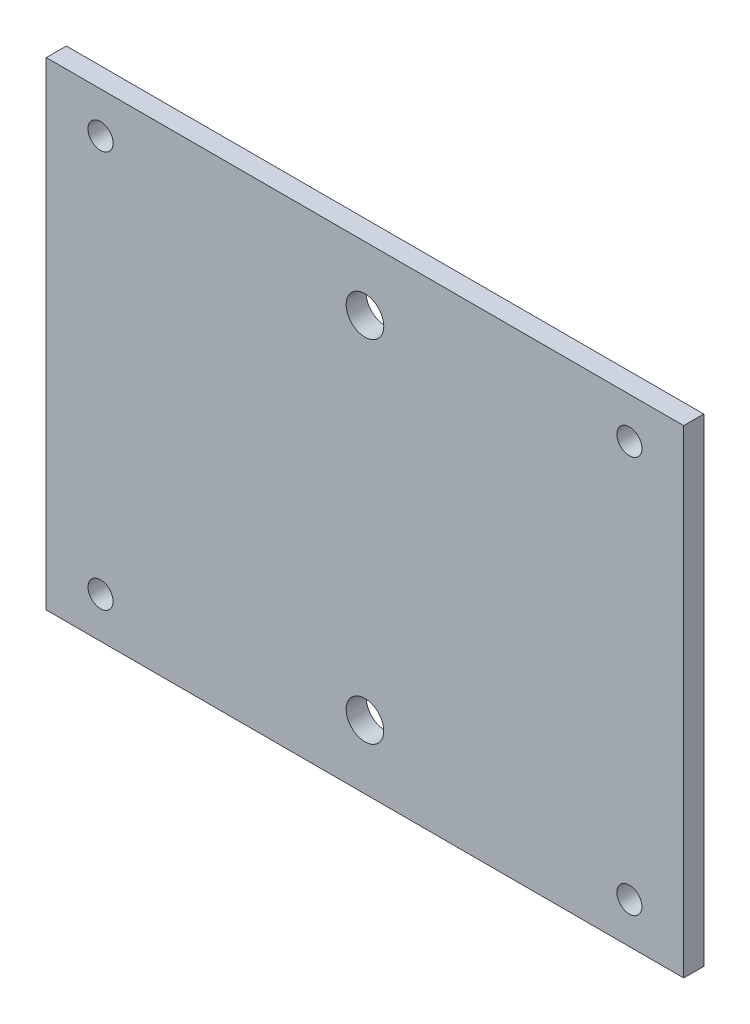
ISO-10303-21;
HEADER;
FILE_DESCRIPTION(('STEP AP214'),'2;1');
FILE_NAME('part.step','',(''),(''),'','','');
FILE_SCHEMA(('AUTOMOTIVE_DESIGN { 1 0 10303 214 1 1 1 1 }'));
ENDSEC;
DATA;
#1=APPLICATION_CONTEXT('core data for automotive mechanical design processes');
#2=APPLICATION_PROTOCOL_DEFINITION('international standard','automotive_design',2000,#1);
#3=PRODUCT_CONTEXT('',#1,'mechanical');
#4=PRODUCT('Part','Part','',(#3));
#5=PRODUCT_RELATED_PRODUCT_CATEGORY('part','',(#4));
#6=PRODUCT_DEFINITION_FORMATION('','',#4);
#7=PRODUCT_DEFINITION_CONTEXT('part definition',#1,'design');
#8=PRODUCT_DEFINITION('design','',#6,#7);
#9=PRODUCT_DEFINITION_SHAPE('','',#8);
#10=(LENGTH_UNIT() NAMED_UNIT(*) SI_UNIT(.MILLI.,.METRE.));
#11=(NAMED_UNIT(*) PLANE_ANGLE_UNIT() SI_UNIT($,.RADIAN.));
#12=(NAMED_UNIT(*) SI_UNIT($,.STERADIAN.) SOLID_ANGLE_UNIT());
#13=UNCERTAINTY_MEASURE_WITH_UNIT(LENGTH_MEASURE(1.E-05),#10,'distance_accuracy_value','');
#14=(GEOMETRIC_REPRESENTATION_CONTEXT(3) GLOBAL_UNCERTAINTY_ASSIGNED_CONTEXT((#13)) GLOBAL_UNIT_ASSIGNED_CONTEXT((#10,
#11,#12)) REPRESENTATION_CONTEXT('',''));
#15=CARTESIAN_POINT('',(0.,0.,0.));
#16=DIRECTION('',(0.,0.,1.));
#17=DIRECTION('',(1.,0.,0.));
#18=AXIS2_PLACEMENT_3D('',#15,#16,#17);
#19=CARTESIAN_POINT('',(0.,0.,1.6));
#20=DIRECTION('',(0.,0.,-1.));
#21=DIRECTION('',(-1.,0.,0.));
#22=AXIS2_PLACEMENT_3D('',#19,#20,#21);
#23=PLANE('',#22);
#24=DIRECTION('',(0.,1.,0.));
#25=VECTOR('',#24,1.);
#26=CARTESIAN_POINT('',(25.42,-19.075,1.6));
#27=LINE('',#26,#25);
#28=CARTESIAN_POINT('',(25.42,-19.075,1.6));
#29=VERTEX_POINT('',#28);
#30=CARTESIAN_POINT('',(25.42,19.075,1.6));
#31=VERTEX_POINT('',#30);
#32=EDGE_CURVE('E100',#29,#31,#27,.T.);
#33=ORIENTED_EDGE('',*,*,#32,.T.);
#34=DIRECTION('',(-1.,0.,0.));
#35=VECTOR('',#34,1.);
#36=CARTESIAN_POINT('',(-25.42,19.075,1.6));
#37=LINE('',#36,#35);
#38=CARTESIAN_POINT('',(-25.42,19.075,1.6));
#39=VERTEX_POINT('',#38);
#40=EDGE_CURVE('E95',#31,#39,#37,.T.);
#41=ORIENTED_EDGE('',*,*,#40,.T.);
#42=DIRECTION('',(0.,-1.,0.));
#43=VECTOR('',#42,1.);
#44=CARTESIAN_POINT('',(-25.42,-19.075,1.6));
#45=LINE('',#44,#43);
#46=CARTESIAN_POINT('',(-25.42,-19.075,1.6));
#47=VERTEX_POINT('',#46);
#48=EDGE_CURVE('E98',#39,#47,#45,.T.);
#49=ORIENTED_EDGE('',*,*,#48,.T.);
#50=DIRECTION('',(1.,0.,0.));
#51=VECTOR('',#50,1.);
#52=CARTESIAN_POINT('',(-25.42,-19.075,1.6));
#53=LINE('',#52,#51);
#54=EDGE_CURVE('E65',#47,#29,#53,.T.);
#55=ORIENTED_EDGE('',*,*,#54,.T.);
#56=EDGE_LOOP('',(#33,#41,#49,#55));
#57=FACE_BOUND('',#56,.T.);
#58=CARTESIAN_POINT('',(0.,13.975,1.6));
#59=DIRECTION('',(0.,0.,1.));
#60=DIRECTION('',(1.,0.,0.));
#61=AXIS2_PLACEMENT_3D('',#58,#59,#60);
#62=CIRCLE('',#61,1.5);
#63=CARTESIAN_POINT('',(1.5,13.975,1.6));
#64=VERTEX_POINT('',#63);
#65=EDGE_CURVE('E120',#64,#64,#62,.T.);
#66=ORIENTED_EDGE('',*,*,#65,.F.);
#67=EDGE_LOOP('',(#66));
#68=FACE_BOUND('',#67,.T.);
#69=CARTESIAN_POINT('',(0.,-13.975,1.6));
#70=DIRECTION('',(0.,0.,1.));
#71=DIRECTION('',(-1.,0.,0.));
#72=AXIS2_PLACEMENT_3D('',#69,#70,#71);
#73=CIRCLE('',#72,1.5);
#74=CARTESIAN_POINT('',(-1.5,-13.975,1.6));
#75=VERTEX_POINT('',#74);
#76=EDGE_CURVE('E142',#75,#75,#73,.T.);
#77=ORIENTED_EDGE('',*,*,#76,.F.);
#78=EDGE_LOOP('',(#77));
#79=FACE_BOUND('',#78,.T.);
#80=CARTESIAN_POINT('',(-21.0889384010485,15.825,1.6));
#81=DIRECTION('',(0.,0.,1.));
#82=DIRECTION('',(1.,0.,0.));
#83=AXIS2_PLACEMENT_3D('',#80,#81,#82);
#84=CIRCLE('',#83,1.);
#85=CARTESIAN_POINT('',(-20.0889384010485,15.825,1.6));
#86=VERTEX_POINT('',#85);
#87=EDGE_CURVE('E150',#86,#86,#84,.T.);
#88=ORIENTED_EDGE('',*,*,#87,.F.);
#89=EDGE_LOOP('',(#88));
#90=FACE_BOUND('',#89,.T.);
#91=CARTESIAN_POINT('',(21.0889384010485,15.825,1.6));
#92=DIRECTION('',(0.,0.,1.));
#93=DIRECTION('',(-1.,0.,0.));
#94=AXIS2_PLACEMENT_3D('',#91,#92,#93);
#95=CIRCLE('',#94,1.);
#96=CARTESIAN_POINT('',(20.0889384010485,15.825,1.6));
#97=VERTEX_POINT('',#96);
#98=EDGE_CURVE('E158',#97,#97,#95,.T.);
#99=ORIENTED_EDGE('',*,*,#98,.F.);
#100=EDGE_LOOP('',(#99));
#101=FACE_BOUND('',#100,.T.);
#102=CARTESIAN_POINT('',(21.0889384010485,-15.825,1.6));
#103=DIRECTION('',(0.,0.,1.));
#104=DIRECTION('',(1.,0.,0.));
#105=AXIS2_PLACEMENT_3D('',#102,#103,#104);
#106=CIRCLE('',#105,1.);
#107=CARTESIAN_POINT('',(22.0889384010485,-15.825,1.6));
#108=VERTEX_POINT('',#107);
#109=EDGE_CURVE('E166',#108,#108,#106,.T.);
#110=ORIENTED_EDGE('',*,*,#109,.F.);
#111=EDGE_LOOP('',(#110));
#112=FACE_BOUND('',#111,.T.);
#113=CARTESIAN_POINT('',(-21.0889384010485,-15.825,1.6));
#114=DIRECTION('',(0.,0.,1.));
#115=DIRECTION('',(-1.,0.,0.));
#116=AXIS2_PLACEMENT_3D('',#113,#114,#115);
#117=CIRCLE('',#116,1.);
#118=CARTESIAN_POINT('',(-22.0889384010485,-15.825,1.6));
#119=VERTEX_POINT('',#118);
#120=EDGE_CURVE('E174',#119,#119,#117,.T.);
#121=ORIENTED_EDGE('',*,*,#120,.F.);
#122=EDGE_LOOP('',(#121));
#123=FACE_BOUND('',#122,.T.);
#124=ADVANCED_FACE('F47',(#57,#68,#79,#90,#101,#112,#123),#23,.F.);
#125=CARTESIAN_POINT('',(0.,0.,0.));
#126=DIRECTION('',(0.,0.,-1.));
#127=DIRECTION('',(-1.,0.,0.));
#128=AXIS2_PLACEMENT_3D('',#125,#126,#127);
#129=PLANE('',#128);
#130=CARTESIAN_POINT('',(21.0889384010485,-15.825,0.));
#131=DIRECTION('',(0.,0.,1.));
#132=DIRECTION('',(1.,0.,0.));
#133=AXIS2_PLACEMENT_3D('',#130,#131,#132);
#134=CIRCLE('',#133,1.);
#135=CARTESIAN_POINT('',(22.0889384010485,-15.825,0.));
#136=VERTEX_POINT('',#135);
#137=EDGE_CURVE('E170',#136,#136,#134,.T.);
#138=ORIENTED_EDGE('',*,*,#137,.T.);
#139=EDGE_LOOP('',(#138));
#140=FACE_BOUND('',#139,.T.);
#141=CARTESIAN_POINT('',(-21.0889384010485,15.825,0.));
#142=DIRECTION('',(0.,0.,1.));
#143=DIRECTION('',(1.,0.,0.));
#144=AXIS2_PLACEMENT_3D('',#141,#142,#143);
#145=CIRCLE('',#144,1.);
#146=CARTESIAN_POINT('',(-20.0889384010485,15.825,0.));
#147=VERTEX_POINT('',#146);
#148=EDGE_CURVE('E154',#147,#147,#145,.T.);
#149=ORIENTED_EDGE('',*,*,#148,.T.);
#150=EDGE_LOOP('',(#149));
#151=FACE_BOUND('',#150,.T.);
#152=CARTESIAN_POINT('',(0.,13.975,0.));
#153=DIRECTION('',(0.,0.,1.));
#154=DIRECTION('',(1.,0.,0.));
#155=AXIS2_PLACEMENT_3D('',#152,#153,#154);
#156=CIRCLE('',#155,1.5);
#157=CARTESIAN_POINT('',(1.5,13.975,0.));
#158=VERTEX_POINT('',#157);
#159=EDGE_CURVE('E138',#158,#158,#156,.T.);
#160=ORIENTED_EDGE('',*,*,#159,.T.);
#161=EDGE_LOOP('',(#160));
#162=FACE_BOUND('',#161,.T.);
#163=DIRECTION('',(0.,1.,0.));
#164=VECTOR('',#163,1.);
#165=CARTESIAN_POINT('',(25.42,-19.075,0.));
#166=LINE('',#165,#164);
#167=CARTESIAN_POINT('',(25.42,-19.075,0.));
#168=VERTEX_POINT('',#167);
#169=CARTESIAN_POINT('',(25.42,19.075,0.));
#170=VERTEX_POINT('',#169);
#171=EDGE_CURVE('E116',#168,#170,#166,.T.);
#172=ORIENTED_EDGE('',*,*,#171,.F.);
#173=DIRECTION('',(1.,0.,0.));
#174=VECTOR('',#173,1.);
#175=CARTESIAN_POINT('',(-25.42,-19.075,0.));
#176=LINE('',#175,#174);
#177=CARTESIAN_POINT('',(-25.42,-19.075,0.));
#178=VERTEX_POINT('',#177);
#179=EDGE_CURVE('E88',#178,#168,#176,.T.);
#180=ORIENTED_EDGE('',*,*,#179,.F.);
#181=DIRECTION('',(0.,-1.,0.));
#182=VECTOR('',#181,1.);
#183=CARTESIAN_POINT('',(-25.42,-19.075,0.));
#184=LINE('',#183,#182);
#185=CARTESIAN_POINT('',(-25.42,19.075,0.));
#186=VERTEX_POINT('',#185);
#187=EDGE_CURVE('E82',#186,#178,#184,.T.);
#188=ORIENTED_EDGE('',*,*,#187,.F.);
#189=DIRECTION('',(-1.,0.,0.));
#190=VECTOR('',#189,1.);
#191=CARTESIAN_POINT('',(-25.42,19.075,0.));
#192=LINE('',#191,#190);
#193=EDGE_CURVE('E105',#170,#186,#192,.T.);
#194=ORIENTED_EDGE('',*,*,#193,.F.);
#195=EDGE_LOOP('',(#172,#180,#188,#194));
#196=FACE_BOUND('',#195,.T.);
#197=CARTESIAN_POINT('',(0.,-13.975,0.));
#198=DIRECTION('',(0.,0.,1.));
#199=DIRECTION('',(-1.,0.,0.));
#200=AXIS2_PLACEMENT_3D('',#197,#198,#199);
#201=CIRCLE('',#200,1.5);
#202=CARTESIAN_POINT('',(-1.5,-13.975,0.));
#203=VERTEX_POINT('',#202);
#204=EDGE_CURVE('E146',#203,#203,#201,.T.);
#205=ORIENTED_EDGE('',*,*,#204,.T.);
#206=EDGE_LOOP('',(#205));
#207=FACE_BOUND('',#206,.T.);
#208=CARTESIAN_POINT('',(21.0889384010485,15.825,0.));
#209=DIRECTION('',(0.,0.,1.));
#210=DIRECTION('',(-1.,0.,0.));
#211=AXIS2_PLACEMENT_3D('',#208,#209,#210);
#212=CIRCLE('',#211,1.);
#213=CARTESIAN_POINT('',(20.0889384010485,15.825,0.));
#214=VERTEX_POINT('',#213);
#215=EDGE_CURVE('E162',#214,#214,#212,.T.);
#216=ORIENTED_EDGE('',*,*,#215,.T.);
#217=EDGE_LOOP('',(#216));
#218=FACE_BOUND('',#217,.T.);
#219=CARTESIAN_POINT('',(-21.0889384010485,-15.825,0.));
#220=DIRECTION('',(0.,0.,1.));
#221=DIRECTION('',(-1.,0.,0.));
#222=AXIS2_PLACEMENT_3D('',#219,#220,#221);
#223=CIRCLE('',#222,1.);
#224=CARTESIAN_POINT('',(-22.0889384010485,-15.825,0.));
#225=VERTEX_POINT('',#224);
#226=EDGE_CURVE('E178',#225,#225,#223,.T.);
#227=ORIENTED_EDGE('',*,*,#226,.T.);
#228=EDGE_LOOP('',(#227));
#229=FACE_BOUND('',#228,.T.);
#230=ADVANCED_FACE('F133',(#140,#151,#162,#196,#207,#218,#229),#129,.T.);
#231=CARTESIAN_POINT('',(25.42,-19.075,1.6));
#232=DIRECTION('',(-1.,0.,0.));
#233=DIRECTION('',(0.,0.,1.));
#234=AXIS2_PLACEMENT_3D('',#231,#232,#233);
#235=PLANE('',#234);
#236=ORIENTED_EDGE('',*,*,#171,.T.);
#237=DIRECTION('',(0.,0.,-1.));
#238=VECTOR('',#237,1.);
#239=CARTESIAN_POINT('',(25.42,19.075,1.6));
#240=LINE('',#239,#238);
#241=EDGE_CURVE('E11',#31,#170,#240,.T.);
#242=ORIENTED_EDGE('',*,*,#241,.F.);
#243=ORIENTED_EDGE('',*,*,#32,.F.);
#244=DIRECTION('',(0.,0.,-1.));
#245=VECTOR('',#244,1.);
#246=CARTESIAN_POINT('',(25.42,-19.075,1.6));
#247=LINE('',#246,#245);
#248=EDGE_CURVE('E112',#29,#168,#247,.T.);
#249=ORIENTED_EDGE('',*,*,#248,.T.);
#250=EDGE_LOOP('',(#236,#242,#243,#249));
#251=FACE_BOUND('',#250,.T.);
#252=ADVANCED_FACE('F49',(#251),#235,.F.);
#253=CARTESIAN_POINT('',(-25.42,19.075,1.6));
#254=DIRECTION('',(0.,-1.,0.));
#255=DIRECTION('',(0.,0.,-1.));
#256=AXIS2_PLACEMENT_3D('',#253,#254,#255);
#257=PLANE('',#256);
#258=ORIENTED_EDGE('',*,*,#193,.T.);
#259=DIRECTION('',(0.,0.,-1.));
#260=VECTOR('',#259,1.);
#261=CARTESIAN_POINT('',(-25.42,19.075,1.6));
#262=LINE('',#261,#260);
#263=EDGE_CURVE('E57',#39,#186,#262,.T.);
#264=ORIENTED_EDGE('',*,*,#263,.F.);
#265=ORIENTED_EDGE('',*,*,#40,.F.);
#266=ORIENTED_EDGE('',*,*,#241,.T.);
#267=EDGE_LOOP('',(#258,#264,#265,#266));
#268=FACE_BOUND('',#267,.T.);
#269=ADVANCED_FACE('F104',(#268),#257,.F.);
#270=CARTESIAN_POINT('',(-25.42,-19.075,1.6));
#271=DIRECTION('',(1.,0.,0.));
#272=DIRECTION('',(0.,0.,-1.));
#273=AXIS2_PLACEMENT_3D('',#270,#271,#272);
#274=PLANE('',#273);
#275=ORIENTED_EDGE('',*,*,#187,.T.);
#276=DIRECTION('',(0.,0.,-1.));
#277=VECTOR('',#276,1.);
#278=CARTESIAN_POINT('',(-25.42,-19.075,1.6));
#279=LINE('',#278,#277);
#280=EDGE_CURVE('E107',#47,#178,#279,.T.);
#281=ORIENTED_EDGE('',*,*,#280,.F.);
#282=ORIENTED_EDGE('',*,*,#48,.F.);
#283=ORIENTED_EDGE('',*,*,#263,.T.);
#284=EDGE_LOOP('',(#275,#281,#282,#283));
#285=FACE_BOUND('',#284,.T.);
#286=ADVANCED_FACE('F108',(#285),#274,.F.);
#287=CARTESIAN_POINT('',(-25.42,-19.075,1.6));
#288=DIRECTION('',(0.,1.,0.));
#289=DIRECTION('',(0.,0.,1.));
#290=AXIS2_PLACEMENT_3D('',#287,#288,#289);
#291=PLANE('',#290);
#292=ORIENTED_EDGE('',*,*,#179,.T.);
#293=ORIENTED_EDGE('',*,*,#248,.F.);
#294=ORIENTED_EDGE('',*,*,#54,.F.);
#295=ORIENTED_EDGE('',*,*,#280,.T.);
#296=EDGE_LOOP('',(#292,#293,#294,#295));
#297=FACE_BOUND('',#296,.T.);
#298=ADVANCED_FACE('F130',(#297),#291,.F.);
#299=CARTESIAN_POINT('',(0.,13.975,1.6));
#300=DIRECTION('',(0.,0.,-1.));
#301=DIRECTION('',(-1.,0.,0.));
#302=AXIS2_PLACEMENT_3D('',#299,#300,#301);
#303=CYLINDRICAL_SURFACE('',#302,1.5);
#304=ORIENTED_EDGE('',*,*,#65,.T.);
#305=EDGE_LOOP('',(#304));
#306=FACE_BOUND('',#305,.T.);
#307=ORIENTED_EDGE('',*,*,#159,.F.);
#308=EDGE_LOOP('',(#307));
#309=FACE_BOUND('',#308,.T.);
#310=ADVANCED_FACE('F197',(#306,#309),#303,.F.);
#311=CARTESIAN_POINT('',(0.,-13.975,1.6));
#312=DIRECTION('',(0.,0.,-1.));
#313=DIRECTION('',(-1.,0.,0.));
#314=AXIS2_PLACEMENT_3D('',#311,#312,#313);
#315=CYLINDRICAL_SURFACE('',#314,1.5);
#316=ORIENTED_EDGE('',*,*,#76,.T.);
#317=EDGE_LOOP('',(#316));
#318=FACE_BOUND('',#317,.T.);
#319=ORIENTED_EDGE('',*,*,#204,.F.);
#320=EDGE_LOOP('',(#319));
#321=FACE_BOUND('',#320,.T.);
#322=ADVANCED_FACE('F242',(#318,#321),#315,.F.);
#323=CARTESIAN_POINT('',(-21.0889384010485,15.825,1.6));
#324=DIRECTION('',(0.,0.,-1.));
#325=DIRECTION('',(-1.,0.,0.));
#326=AXIS2_PLACEMENT_3D('',#323,#324,#325);
#327=CYLINDRICAL_SURFACE('',#326,1.);
#328=ORIENTED_EDGE('',*,*,#87,.T.);
#329=EDGE_LOOP('',(#328));
#330=FACE_BOUND('',#329,.T.);
#331=ORIENTED_EDGE('',*,*,#148,.F.);
#332=EDGE_LOOP('',(#331));
#333=FACE_BOUND('',#332,.T.);
#334=ADVANCED_FACE('F250',(#330,#333),#327,.F.);
#335=CARTESIAN_POINT('',(21.0889384010485,15.825,1.6));
#336=DIRECTION('',(0.,0.,-1.));
#337=DIRECTION('',(-1.,0.,0.));
#338=AXIS2_PLACEMENT_3D('',#335,#336,#337);
#339=CYLINDRICAL_SURFACE('',#338,1.);
#340=ORIENTED_EDGE('',*,*,#98,.T.);
#341=EDGE_LOOP('',(#340));
#342=FACE_BOUND('',#341,.T.);
#343=ORIENTED_EDGE('',*,*,#215,.F.);
#344=EDGE_LOOP('',(#343));
#345=FACE_BOUND('',#344,.T.);
#346=ADVANCED_FACE('F258',(#342,#345),#339,.F.);
#347=CARTESIAN_POINT('',(21.0889384010485,-15.825,1.6));
#348=DIRECTION('',(0.,0.,-1.));
#349=DIRECTION('',(-1.,0.,0.));
#350=AXIS2_PLACEMENT_3D('',#347,#348,#349);
#351=CYLINDRICAL_SURFACE('',#350,1.);
#352=ORIENTED_EDGE('',*,*,#109,.T.);
#353=EDGE_LOOP('',(#352));
#354=FACE_BOUND('',#353,.T.);
#355=ORIENTED_EDGE('',*,*,#137,.F.);
#356=EDGE_LOOP('',(#355));
#357=FACE_BOUND('',#356,.T.);
#358=ADVANCED_FACE('F267',(#354,#357),#351,.F.);
#359=CARTESIAN_POINT('',(-21.0889384010485,-15.825,1.6));
#360=DIRECTION('',(0.,0.,-1.));
#361=DIRECTION('',(-1.,0.,0.));
#362=AXIS2_PLACEMENT_3D('',#359,#360,#361);
#363=CYLINDRICAL_SURFACE('',#362,1.);
#364=ORIENTED_EDGE('',*,*,#120,.T.);
#365=EDGE_LOOP('',(#364));
#366=FACE_BOUND('',#365,.T.);
#367=ORIENTED_EDGE('',*,*,#226,.F.);
#368=EDGE_LOOP('',(#367));
#369=FACE_BOUND('',#368,.T.);
#370=ADVANCED_FACE('F186',(#366,#369),#363,.F.);
#371=CLOSED_SHELL('',(#124,#230,#252,#269,#286,#298,#310,#322,#334,#346,#358,#370));
#372=MANIFOLD_SOLID_BREP('B2',#371);
#373=ADVANCED_BREP_SHAPE_REPRESENTATION('',(#18,#372),#14);
#374=SHAPE_DEFINITION_REPRESENTATION(#9,#373);
ENDSEC;
END-ISO-10303-21;
